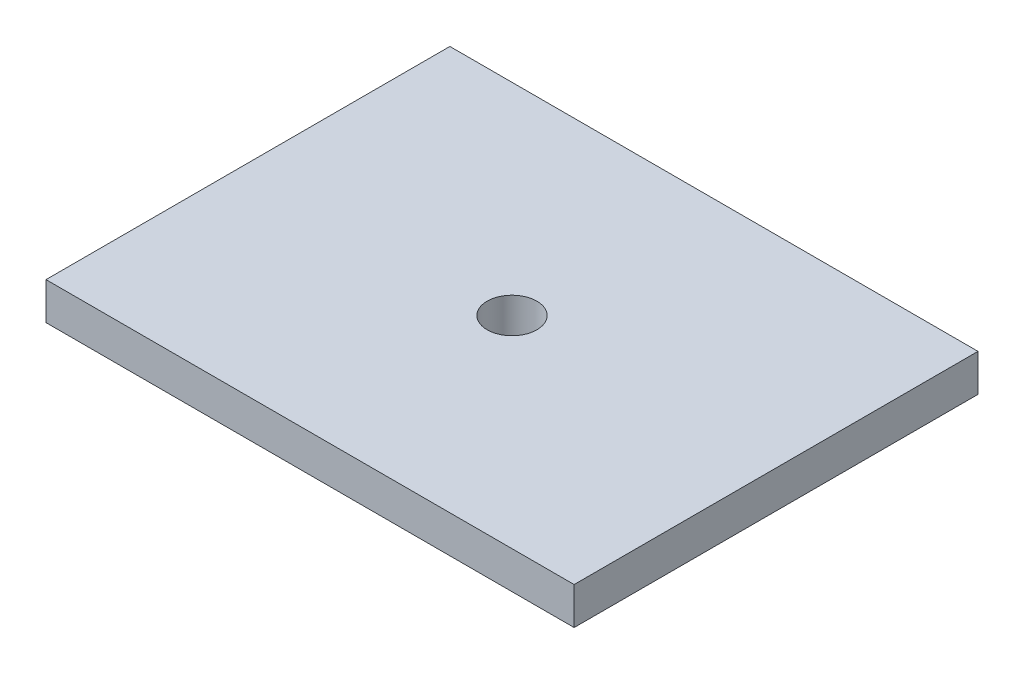
ISO-10303-21;
HEADER;
FILE_DESCRIPTION(('STEP AP214'),'2;1');
FILE_NAME('part.step','',(''),(''),'','','');
FILE_SCHEMA(('AUTOMOTIVE_DESIGN { 1 0 10303 214 1 1 1 1 }'));
ENDSEC;
DATA;
#1=APPLICATION_CONTEXT('core data for automotive mechanical design processes');
#2=APPLICATION_PROTOCOL_DEFINITION('international standard','automotive_design',2000,#1);
#3=PRODUCT_CONTEXT('',#1,'mechanical');
#4=PRODUCT('Part','Part','',(#3));
#5=PRODUCT_RELATED_PRODUCT_CATEGORY('part','',(#4));
#6=PRODUCT_DEFINITION_FORMATION('','',#4);
#7=PRODUCT_DEFINITION_CONTEXT('part definition',#1,'design');
#8=PRODUCT_DEFINITION('design','',#6,#7);
#9=PRODUCT_DEFINITION_SHAPE('','',#8);
#10=(LENGTH_UNIT() NAMED_UNIT(*) SI_UNIT(.MILLI.,.METRE.));
#11=(NAMED_UNIT(*) PLANE_ANGLE_UNIT() SI_UNIT($,.RADIAN.));
#12=(NAMED_UNIT(*) SI_UNIT($,.STERADIAN.) SOLID_ANGLE_UNIT());
#13=UNCERTAINTY_MEASURE_WITH_UNIT(LENGTH_MEASURE(1.E-05),#10,'distance_accuracy_value','');
#14=(GEOMETRIC_REPRESENTATION_CONTEXT(3) GLOBAL_UNCERTAINTY_ASSIGNED_CONTEXT((#13)) GLOBAL_UNIT_ASSIGNED_CONTEXT((#10,
#11,#12)) REPRESENTATION_CONTEXT('',''));
#15=CARTESIAN_POINT('',(0.,0.,0.));
#16=DIRECTION('',(0.,0.,1.));
#17=DIRECTION('',(1.,0.,0.));
#18=AXIS2_PLACEMENT_3D('',#15,#16,#17);
#19=CARTESIAN_POINT('',(42.5,6.,-3.66501061754093));
#20=DIRECTION('',(-1.,0.,0.));
#21=DIRECTION('',(0.,0.,1.));
#22=AXIS2_PLACEMENT_3D('',#19,#20,#21);
#23=PLANE('',#22);
#24=DIRECTION('',(0.,0.,-1.));
#25=VECTOR('',#24,1.);
#26=CARTESIAN_POINT('',(42.5,0.,-3.66501061754093));
#27=LINE('',#26,#25);
#28=CARTESIAN_POINT('',(42.5,0.,61.3349893824591));
#29=VERTEX_POINT('',#28);
#30=CARTESIAN_POINT('',(42.5,0.,-3.66501061754093));
#31=VERTEX_POINT('',#30);
#32=EDGE_CURVE('E95',#29,#31,#27,.T.);
#33=ORIENTED_EDGE('',*,*,#32,.T.);
#34=DIRECTION('',(0.,-1.,0.));
#35=VECTOR('',#34,1.);
#36=CARTESIAN_POINT('',(42.5,6.,-3.66501061754093));
#37=LINE('',#36,#35);
#38=CARTESIAN_POINT('',(42.5,6.,-3.66501061754093));
#39=VERTEX_POINT('',#38);
#40=EDGE_CURVE('E11',#39,#31,#37,.T.);
#41=ORIENTED_EDGE('',*,*,#40,.F.);
#42=DIRECTION('',(0.,0.,-1.));
#43=VECTOR('',#42,1.);
#44=CARTESIAN_POINT('',(42.5,6.,-3.66501061754093));
#45=LINE('',#44,#43);
#46=CARTESIAN_POINT('',(42.5,6.,61.3349893824591));
#47=VERTEX_POINT('',#46);
#48=EDGE_CURVE('E83',#47,#39,#45,.T.);
#49=ORIENTED_EDGE('',*,*,#48,.F.);
#50=DIRECTION('',(0.,-1.,0.));
#51=VECTOR('',#50,1.);
#52=CARTESIAN_POINT('',(42.5,6.,61.3349893824591));
#53=LINE('',#52,#51);
#54=EDGE_CURVE('E91',#47,#29,#53,.T.);
#55=ORIENTED_EDGE('',*,*,#54,.T.);
#56=EDGE_LOOP('',(#33,#41,#49,#55));
#57=FACE_BOUND('',#56,.T.);
#58=ADVANCED_FACE('F32',(#57),#23,.F.);
#59=CARTESIAN_POINT('',(-42.5,6.,-3.66501061754093));
#60=DIRECTION('',(0.,0.,1.));
#61=DIRECTION('',(1.,0.,0.));
#62=AXIS2_PLACEMENT_3D('',#59,#60,#61);
#63=PLANE('',#62);
#64=DIRECTION('',(-1.,0.,0.));
#65=VECTOR('',#64,1.);
#66=CARTESIAN_POINT('',(-42.5,0.,-3.66501061754093));
#67=LINE('',#66,#65);
#68=CARTESIAN_POINT('',(-42.5,0.,-3.66501061754093));
#69=VERTEX_POINT('',#68);
#70=EDGE_CURVE('E87',#31,#69,#67,.T.);
#71=ORIENTED_EDGE('',*,*,#70,.T.);
#72=DIRECTION('',(0.,-1.,0.));
#73=VECTOR('',#72,1.);
#74=CARTESIAN_POINT('',(-42.5,6.,-3.66501061754093));
#75=LINE('',#74,#73);
#76=CARTESIAN_POINT('',(-42.5,6.,-3.66501061754093));
#77=VERTEX_POINT('',#76);
#78=EDGE_CURVE('E40',#77,#69,#75,.T.);
#79=ORIENTED_EDGE('',*,*,#78,.F.);
#80=DIRECTION('',(-1.,0.,0.));
#81=VECTOR('',#80,1.);
#82=CARTESIAN_POINT('',(-42.5,6.,-3.66501061754093));
#83=LINE('',#82,#81);
#84=EDGE_CURVE('E78',#39,#77,#83,.T.);
#85=ORIENTED_EDGE('',*,*,#84,.F.);
#86=ORIENTED_EDGE('',*,*,#40,.T.);
#87=EDGE_LOOP('',(#71,#79,#85,#86));
#88=FACE_BOUND('',#87,.T.);
#89=ADVANCED_FACE('F86',(#88),#63,.F.);
#90=CARTESIAN_POINT('',(-42.5,6.,-3.66501061754093));
#91=DIRECTION('',(1.,0.,0.));
#92=DIRECTION('',(0.,0.,-1.));
#93=AXIS2_PLACEMENT_3D('',#90,#91,#92);
#94=PLANE('',#93);
#95=DIRECTION('',(0.,0.,1.));
#96=VECTOR('',#95,1.);
#97=CARTESIAN_POINT('',(-42.5,0.,-3.66501061754093));
#98=LINE('',#97,#96);
#99=CARTESIAN_POINT('',(-42.5,0.,61.3349893824591));
#100=VERTEX_POINT('',#99);
#101=EDGE_CURVE('E65',#69,#100,#98,.T.);
#102=ORIENTED_EDGE('',*,*,#101,.T.);
#103=DIRECTION('',(0.,-1.,0.));
#104=VECTOR('',#103,1.);
#105=CARTESIAN_POINT('',(-42.5,6.,61.3349893824591));
#106=LINE('',#105,#104);
#107=CARTESIAN_POINT('',(-42.5,6.,61.3349893824591));
#108=VERTEX_POINT('',#107);
#109=EDGE_CURVE('E88',#108,#100,#106,.T.);
#110=ORIENTED_EDGE('',*,*,#109,.F.);
#111=DIRECTION('',(0.,0.,1.));
#112=VECTOR('',#111,1.);
#113=CARTESIAN_POINT('',(-42.5,6.,-3.66501061754093));
#114=LINE('',#113,#112);
#115=EDGE_CURVE('E81',#77,#108,#114,.T.);
#116=ORIENTED_EDGE('',*,*,#115,.F.);
#117=ORIENTED_EDGE('',*,*,#78,.T.);
#118=EDGE_LOOP('',(#102,#110,#116,#117));
#119=FACE_BOUND('',#118,.T.);
#120=ADVANCED_FACE('F89',(#119),#94,.F.);
#121=CARTESIAN_POINT('',(-42.5,6.,61.3349893824591));
#122=DIRECTION('',(0.,0.,-1.));
#123=DIRECTION('',(-1.,0.,0.));
#124=AXIS2_PLACEMENT_3D('',#121,#122,#123);
#125=PLANE('',#124);
#126=DIRECTION('',(1.,0.,0.));
#127=VECTOR('',#126,1.);
#128=CARTESIAN_POINT('',(-42.5,0.,61.3349893824591));
#129=LINE('',#128,#127);
#130=EDGE_CURVE('E71',#100,#29,#129,.T.);
#131=ORIENTED_EDGE('',*,*,#130,.T.);
#132=ORIENTED_EDGE('',*,*,#54,.F.);
#133=DIRECTION('',(1.,0.,0.));
#134=VECTOR('',#133,1.);
#135=CARTESIAN_POINT('',(-42.5,6.,61.3349893824591));
#136=LINE('',#135,#134);
#137=EDGE_CURVE('E48',#108,#47,#136,.T.);
#138=ORIENTED_EDGE('',*,*,#137,.F.);
#139=ORIENTED_EDGE('',*,*,#109,.T.);
#140=EDGE_LOOP('',(#131,#132,#138,#139));
#141=FACE_BOUND('',#140,.T.);
#142=ADVANCED_FACE('F103',(#141),#125,.F.);
#143=CARTESIAN_POINT('',(42.5,6.,61.3349893824591));
#144=DIRECTION('',(0.,1.,0.));
#145=DIRECTION('',(0.,0.,1.));
#146=AXIS2_PLACEMENT_3D('',#143,#144,#145);
#147=PLANE('',#146);
#148=CARTESIAN_POINT('',(0.,6.,28.8349893824591));
#149=DIRECTION('',(0.,1.,0.));
#150=DIRECTION('',(0.,0.,1.));
#151=AXIS2_PLACEMENT_3D('',#148,#149,#150);
#152=CIRCLE('',#151,4.);
#153=CARTESIAN_POINT('',(0.,6.,32.8349893824591));
#154=VERTEX_POINT('',#153);
#155=EDGE_CURVE('E109',#154,#154,#152,.T.);
#156=ORIENTED_EDGE('',*,*,#155,.F.);
#157=EDGE_LOOP('',(#156));
#158=FACE_BOUND('',#157,.T.);
#159=ORIENTED_EDGE('',*,*,#48,.T.);
#160=ORIENTED_EDGE('',*,*,#84,.T.);
#161=ORIENTED_EDGE('',*,*,#115,.T.);
#162=ORIENTED_EDGE('',*,*,#137,.T.);
#163=EDGE_LOOP('',(#159,#160,#161,#162));
#164=FACE_BOUND('',#163,.T.);
#165=ADVANCED_FACE('F79',(#158,#164),#147,.T.);
#166=CARTESIAN_POINT('',(42.5,0.,61.3349893824591));
#167=DIRECTION('',(0.,1.,0.));
#168=DIRECTION('',(0.,0.,1.));
#169=AXIS2_PLACEMENT_3D('',#166,#167,#168);
#170=PLANE('',#169);
#171=CARTESIAN_POINT('',(0.,0.,28.8349893824591));
#172=DIRECTION('',(0.,1.,0.));
#173=DIRECTION('',(0.,0.,1.));
#174=AXIS2_PLACEMENT_3D('',#171,#172,#173);
#175=CIRCLE('',#174,4.);
#176=CARTESIAN_POINT('',(0.,0.,32.8349893824591));
#177=VERTEX_POINT('',#176);
#178=EDGE_CURVE('E98',#177,#177,#175,.T.);
#179=ORIENTED_EDGE('',*,*,#178,.T.);
#180=EDGE_LOOP('',(#179));
#181=FACE_BOUND('',#180,.T.);
#182=ORIENTED_EDGE('',*,*,#32,.F.);
#183=ORIENTED_EDGE('',*,*,#130,.F.);
#184=ORIENTED_EDGE('',*,*,#101,.F.);
#185=ORIENTED_EDGE('',*,*,#70,.F.);
#186=EDGE_LOOP('',(#182,#183,#184,#185));
#187=FACE_BOUND('',#186,.T.);
#188=ADVANCED_FACE('F106',(#181,#187),#170,.F.);
#189=CARTESIAN_POINT('',(0.,0.,28.8349893824591));
#190=DIRECTION('',(0.,1.,0.));
#191=DIRECTION('',(0.,0.,1.));
#192=AXIS2_PLACEMENT_3D('',#189,#190,#191);
#193=CYLINDRICAL_SURFACE('',#192,4.);
#194=ORIENTED_EDGE('',*,*,#178,.F.);
#195=EDGE_LOOP('',(#194));
#196=FACE_BOUND('',#195,.T.);
#197=ORIENTED_EDGE('',*,*,#155,.T.);
#198=EDGE_LOOP('',(#197));
#199=FACE_BOUND('',#198,.T.);
#200=ADVANCED_FACE('F116',(#196,#199),#193,.F.);
#201=CLOSED_SHELL('',(#58,#89,#120,#142,#165,#188,#200));
#202=MANIFOLD_SOLID_BREP('B2',#201);
#203=ADVANCED_BREP_SHAPE_REPRESENTATION('',(#18,#202),#14);
#204=SHAPE_DEFINITION_REPRESENTATION(#9,#203);
ENDSEC;
END-ISO-10303-21;
